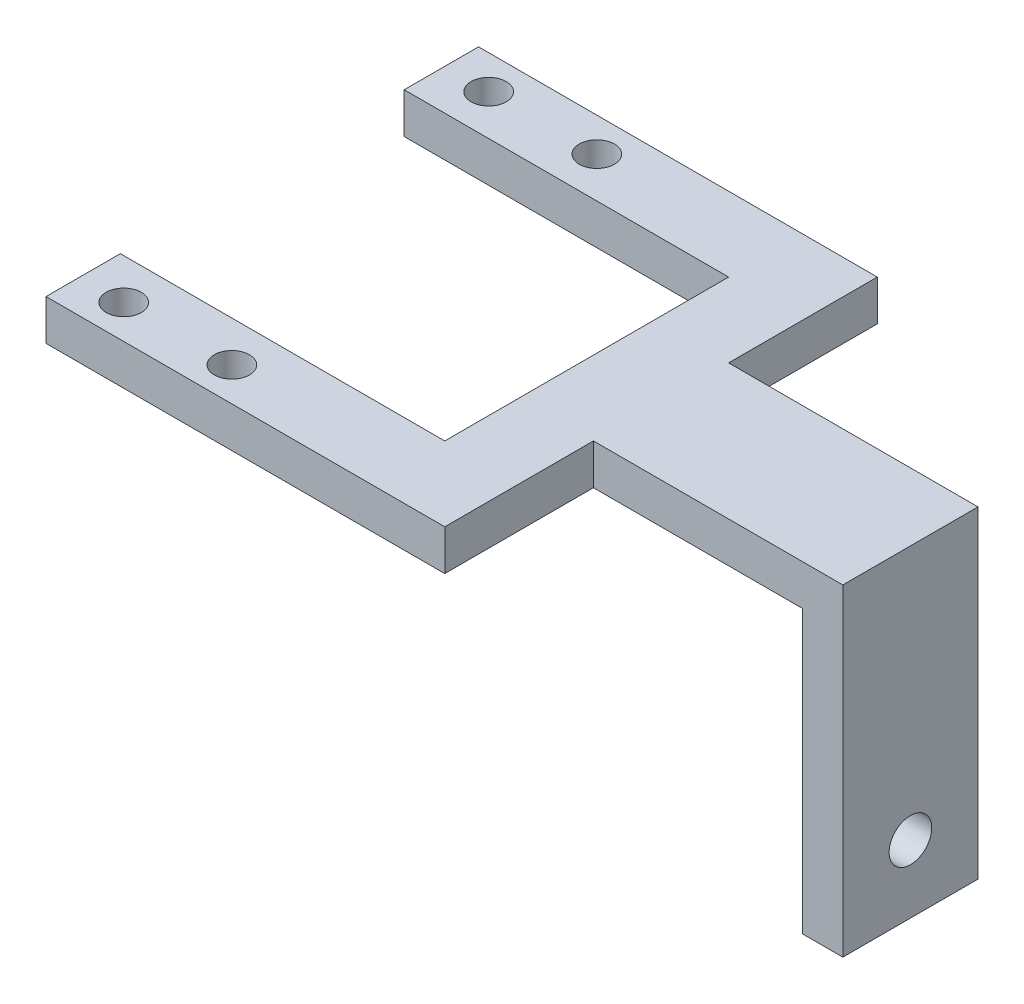
ISO-10303-21;
HEADER;
FILE_DESCRIPTION(('STEP AP214'),'2;1');
FILE_NAME('part.step','',(''),(''),'','','');
FILE_SCHEMA(('AUTOMOTIVE_DESIGN { 1 0 10303 214 1 1 1 1 }'));
ENDSEC;
DATA;
#1=APPLICATION_CONTEXT('core data for automotive mechanical design processes');
#2=APPLICATION_PROTOCOL_DEFINITION('international standard','automotive_design',2000,#1);
#3=PRODUCT_CONTEXT('',#1,'mechanical');
#4=PRODUCT('Part','Part','',(#3));
#5=PRODUCT_RELATED_PRODUCT_CATEGORY('part','',(#4));
#6=PRODUCT_DEFINITION_FORMATION('','',#4);
#7=PRODUCT_DEFINITION_CONTEXT('part definition',#1,'design');
#8=PRODUCT_DEFINITION('design','',#6,#7);
#9=PRODUCT_DEFINITION_SHAPE('','',#8);
#10=(LENGTH_UNIT() NAMED_UNIT(*) SI_UNIT(.MILLI.,.METRE.));
#11=(NAMED_UNIT(*) PLANE_ANGLE_UNIT() SI_UNIT($,.RADIAN.));
#12=(NAMED_UNIT(*) SI_UNIT($,.STERADIAN.) SOLID_ANGLE_UNIT());
#13=UNCERTAINTY_MEASURE_WITH_UNIT(LENGTH_MEASURE(1.E-05),#10,'distance_accuracy_value','');
#14=(GEOMETRIC_REPRESENTATION_CONTEXT(3) GLOBAL_UNCERTAINTY_ASSIGNED_CONTEXT((#13)) GLOBAL_UNIT_ASSIGNED_CONTEXT((#10,
#11,#12)) REPRESENTATION_CONTEXT('',''));
#15=CARTESIAN_POINT('',(0.,0.,0.));
#16=DIRECTION('',(0.,0.,1.));
#17=DIRECTION('',(1.,0.,0.));
#18=AXIS2_PLACEMENT_3D('',#15,#16,#17);
#19=CARTESIAN_POINT('',(0.,-3.,5.));
#20=DIRECTION('',(0.,0.,1.));
#21=DIRECTION('',(1.,0.,0.));
#22=AXIS2_PLACEMENT_3D('',#19,#20,#21);
#23=PLANE('',#22);
#24=DIRECTION('',(1.,0.,0.));
#25=VECTOR('',#24,1.);
#26=CARTESIAN_POINT('',(0.,-3.,5.));
#27=LINE('',#26,#25);
#28=CARTESIAN_POINT('',(14.75,-3.,5.));
#29=VERTEX_POINT('',#28);
#30=CARTESIAN_POINT('',(30.2,-3.,5.));
#31=VERTEX_POINT('',#30);
#32=EDGE_CURVE('E285',#29,#31,#27,.T.);
#33=ORIENTED_EDGE('',*,*,#32,.T.);
#34=DIRECTION('',(0.,1.,0.));
#35=VECTOR('',#34,1.);
#36=CARTESIAN_POINT('',(30.2,-23.85,5.));
#37=LINE('',#36,#35);
#38=CARTESIAN_POINT('',(30.2,-23.85,5.));
#39=VERTEX_POINT('',#38);
#40=EDGE_CURVE('E59',#39,#31,#37,.T.);
#41=ORIENTED_EDGE('',*,*,#40,.F.);
#42=DIRECTION('',(1.,0.,0.));
#43=VECTOR('',#42,1.);
#44=CARTESIAN_POINT('',(0.,-23.85,5.));
#45=LINE('',#44,#43);
#46=CARTESIAN_POINT('',(33.2,-23.85,5.));
#47=VERTEX_POINT('',#46);
#48=EDGE_CURVE('E276',#39,#47,#45,.T.);
#49=ORIENTED_EDGE('',*,*,#48,.T.);
#50=DIRECTION('',(0.,1.,0.));
#51=VECTOR('',#50,1.);
#52=CARTESIAN_POINT('',(33.2,-3.,5.));
#53=LINE('',#52,#51);
#54=CARTESIAN_POINT('',(33.2,0.,5.));
#55=VERTEX_POINT('',#54);
#56=EDGE_CURVE('E45',#47,#55,#53,.T.);
#57=ORIENTED_EDGE('',*,*,#56,.T.);
#58=DIRECTION('',(1.,0.,0.));
#59=VECTOR('',#58,1.);
#60=CARTESIAN_POINT('',(0.,0.,5.));
#61=LINE('',#60,#59);
#62=CARTESIAN_POINT('',(14.75,0.,5.));
#63=VERTEX_POINT('',#62);
#64=EDGE_CURVE('E196',#63,#55,#61,.T.);
#65=ORIENTED_EDGE('',*,*,#64,.F.);
#66=DIRECTION('',(0.,1.,0.));
#67=VECTOR('',#66,1.);
#68=CARTESIAN_POINT('',(14.75,-3.,5.));
#69=LINE('',#68,#67);
#70=EDGE_CURVE('E11',#29,#63,#69,.T.);
#71=ORIENTED_EDGE('',*,*,#70,.F.);
#72=EDGE_LOOP('',(#33,#41,#49,#57,#65,#71));
#73=FACE_BOUND('',#72,.T.);
#74=ADVANCED_FACE('F41',(#73),#23,.T.);
#75=CARTESIAN_POINT('',(14.75,-3.,0.));
#76=DIRECTION('',(-1.,0.,0.));
#77=DIRECTION('',(0.,0.,1.));
#78=AXIS2_PLACEMENT_3D('',#75,#76,#77);
#79=PLANE('',#78);
#80=DIRECTION('',(0.,0.,1.));
#81=VECTOR('',#80,1.);
#82=CARTESIAN_POINT('',(14.75,0.,0.));
#83=LINE('',#82,#81);
#84=CARTESIAN_POINT('',(14.75,0.,16.));
#85=VERTEX_POINT('',#84);
#86=EDGE_CURVE('E235',#63,#85,#83,.T.);
#87=ORIENTED_EDGE('',*,*,#86,.T.);
#88=DIRECTION('',(0.,1.,0.));
#89=VECTOR('',#88,1.);
#90=CARTESIAN_POINT('',(14.75,-3.,16.));
#91=LINE('',#90,#89);
#92=CARTESIAN_POINT('',(14.75,-3.,16.));
#93=VERTEX_POINT('',#92);
#94=EDGE_CURVE('E51',#93,#85,#91,.T.);
#95=ORIENTED_EDGE('',*,*,#94,.F.);
#96=DIRECTION('',(0.,0.,1.));
#97=VECTOR('',#96,1.);
#98=CARTESIAN_POINT('',(14.75,-3.,0.));
#99=LINE('',#98,#97);
#100=EDGE_CURVE('E152',#29,#93,#99,.T.);
#101=ORIENTED_EDGE('',*,*,#100,.F.);
#102=ORIENTED_EDGE('',*,*,#70,.T.);
#103=EDGE_LOOP('',(#87,#95,#101,#102));
#104=FACE_BOUND('',#103,.T.);
#105=ADVANCED_FACE('F284',(#104),#79,.F.);
#106=CARTESIAN_POINT('',(0.,-3.,16.));
#107=DIRECTION('',(0.,0.,-1.));
#108=DIRECTION('',(-1.,0.,0.));
#109=AXIS2_PLACEMENT_3D('',#106,#107,#108);
#110=PLANE('',#109);
#111=DIRECTION('',(-1.,0.,0.));
#112=VECTOR('',#111,1.);
#113=CARTESIAN_POINT('',(0.,0.,16.));
#114=LINE('',#113,#112);
#115=CARTESIAN_POINT('',(-14.75,0.,16.));
#116=VERTEX_POINT('',#115);
#117=EDGE_CURVE('E161',#85,#116,#114,.T.);
#118=ORIENTED_EDGE('',*,*,#117,.T.);
#119=DIRECTION('',(0.,1.,0.));
#120=VECTOR('',#119,1.);
#121=CARTESIAN_POINT('',(-14.75,-3.,16.));
#122=LINE('',#121,#120);
#123=CARTESIAN_POINT('',(-14.75,-3.,16.));
#124=VERTEX_POINT('',#123);
#125=EDGE_CURVE('E159',#124,#116,#122,.T.);
#126=ORIENTED_EDGE('',*,*,#125,.F.);
#127=DIRECTION('',(-1.,0.,0.));
#128=VECTOR('',#127,1.);
#129=CARTESIAN_POINT('',(0.,-3.,16.));
#130=LINE('',#129,#128);
#131=EDGE_CURVE('E143',#93,#124,#130,.T.);
#132=ORIENTED_EDGE('',*,*,#131,.F.);
#133=ORIENTED_EDGE('',*,*,#94,.T.);
#134=EDGE_LOOP('',(#118,#126,#132,#133));
#135=FACE_BOUND('',#134,.T.);
#136=ADVANCED_FACE('F160',(#135),#110,.F.);
#137=CARTESIAN_POINT('',(-14.75,-3.,0.));
#138=DIRECTION('',(-1.,0.,0.));
#139=DIRECTION('',(0.,0.,1.));
#140=AXIS2_PLACEMENT_3D('',#137,#138,#139);
#141=PLANE('',#140);
#142=DIRECTION('',(0.,0.,1.));
#143=VECTOR('',#142,1.);
#144=CARTESIAN_POINT('',(-14.75,0.,0.));
#145=LINE('',#144,#143);
#146=CARTESIAN_POINT('',(-14.75,0.,10.5));
#147=VERTEX_POINT('',#146);
#148=EDGE_CURVE('E230',#147,#116,#145,.T.);
#149=ORIENTED_EDGE('',*,*,#148,.F.);
#150=DIRECTION('',(0.,1.,0.));
#151=VECTOR('',#150,1.);
#152=CARTESIAN_POINT('',(-14.75,-3.,10.5));
#153=LINE('',#152,#151);
#154=CARTESIAN_POINT('',(-14.75,-3.,10.5));
#155=VERTEX_POINT('',#154);
#156=EDGE_CURVE('E166',#155,#147,#153,.T.);
#157=ORIENTED_EDGE('',*,*,#156,.F.);
#158=DIRECTION('',(0.,0.,1.));
#159=VECTOR('',#158,1.);
#160=CARTESIAN_POINT('',(-14.75,-3.,0.));
#161=LINE('',#160,#159);
#162=EDGE_CURVE('E149',#155,#124,#161,.T.);
#163=ORIENTED_EDGE('',*,*,#162,.T.);
#164=ORIENTED_EDGE('',*,*,#125,.T.);
#165=EDGE_LOOP('',(#149,#157,#163,#164));
#166=FACE_BOUND('',#165,.T.);
#167=ADVANCED_FACE('F168',(#166),#141,.T.);
#168=CARTESIAN_POINT('',(0.,-3.,10.5));
#169=DIRECTION('',(0.,0.,-1.));
#170=DIRECTION('',(-1.,0.,0.));
#171=AXIS2_PLACEMENT_3D('',#168,#169,#170);
#172=PLANE('',#171);
#173=DIRECTION('',(-1.,0.,0.));
#174=VECTOR('',#173,1.);
#175=CARTESIAN_POINT('',(0.,0.,10.5));
#176=LINE('',#175,#174);
#177=CARTESIAN_POINT('',(9.25000000000001,0.,10.5));
#178=VERTEX_POINT('',#177);
#179=EDGE_CURVE('E226',#178,#147,#176,.T.);
#180=ORIENTED_EDGE('',*,*,#179,.F.);
#181=DIRECTION('',(0.,1.,0.));
#182=VECTOR('',#181,1.);
#183=CARTESIAN_POINT('',(9.25000000000001,-3.,10.5));
#184=LINE('',#183,#182);
#185=CARTESIAN_POINT('',(9.25000000000001,-3.,10.5));
#186=VERTEX_POINT('',#185);
#187=EDGE_CURVE('E247',#186,#178,#184,.T.);
#188=ORIENTED_EDGE('',*,*,#187,.F.);
#189=DIRECTION('',(-1.,0.,0.));
#190=VECTOR('',#189,1.);
#191=CARTESIAN_POINT('',(0.,-3.,10.5));
#192=LINE('',#191,#190);
#193=EDGE_CURVE('E170',#186,#155,#192,.T.);
#194=ORIENTED_EDGE('',*,*,#193,.T.);
#195=ORIENTED_EDGE('',*,*,#156,.T.);
#196=EDGE_LOOP('',(#180,#188,#194,#195));
#197=FACE_BOUND('',#196,.T.);
#198=ADVANCED_FACE('F528',(#197),#172,.T.);
#199=CARTESIAN_POINT('',(9.25000000000001,-3.,0.));
#200=DIRECTION('',(-1.,0.,0.));
#201=DIRECTION('',(0.,0.,1.));
#202=AXIS2_PLACEMENT_3D('',#199,#200,#201);
#203=PLANE('',#202);
#204=DIRECTION('',(0.,0.,1.));
#205=VECTOR('',#204,1.);
#206=CARTESIAN_POINT('',(9.25000000000001,0.,0.));
#207=LINE('',#206,#205);
#208=CARTESIAN_POINT('',(9.25,0.,-10.5));
#209=VERTEX_POINT('',#208);
#210=EDGE_CURVE('E222',#209,#178,#207,.T.);
#211=ORIENTED_EDGE('',*,*,#210,.F.);
#212=DIRECTION('',(0.,1.,0.));
#213=VECTOR('',#212,1.);
#214=CARTESIAN_POINT('',(9.25,-3.,-10.5));
#215=LINE('',#214,#213);
#216=CARTESIAN_POINT('',(9.25,-3.,-10.5));
#217=VERTEX_POINT('',#216);
#218=EDGE_CURVE('E250',#217,#209,#215,.T.);
#219=ORIENTED_EDGE('',*,*,#218,.F.);
#220=DIRECTION('',(0.,0.,1.));
#221=VECTOR('',#220,1.);
#222=CARTESIAN_POINT('',(9.25000000000001,-3.,0.));
#223=LINE('',#222,#221);
#224=EDGE_CURVE('E173',#217,#186,#223,.T.);
#225=ORIENTED_EDGE('',*,*,#224,.T.);
#226=ORIENTED_EDGE('',*,*,#187,.T.);
#227=EDGE_LOOP('',(#211,#219,#225,#226));
#228=FACE_BOUND('',#227,.T.);
#229=ADVANCED_FACE('F316',(#228),#203,.T.);
#230=CARTESIAN_POINT('',(0.,-3.,-10.5));
#231=DIRECTION('',(0.,0.,1.));
#232=DIRECTION('',(1.,0.,0.));
#233=AXIS2_PLACEMENT_3D('',#230,#231,#232);
#234=PLANE('',#233);
#235=DIRECTION('',(1.,0.,0.));
#236=VECTOR('',#235,1.);
#237=CARTESIAN_POINT('',(0.,0.,-10.5));
#238=LINE('',#237,#236);
#239=CARTESIAN_POINT('',(-14.75,0.,-10.5));
#240=VERTEX_POINT('',#239);
#241=EDGE_CURVE('E218',#240,#209,#238,.T.);
#242=ORIENTED_EDGE('',*,*,#241,.F.);
#243=DIRECTION('',(0.,1.,0.));
#244=VECTOR('',#243,1.);
#245=CARTESIAN_POINT('',(-14.75,-3.,-10.5));
#246=LINE('',#245,#244);
#247=CARTESIAN_POINT('',(-14.75,-3.,-10.5));
#248=VERTEX_POINT('',#247);
#249=EDGE_CURVE('E253',#248,#240,#246,.T.);
#250=ORIENTED_EDGE('',*,*,#249,.F.);
#251=DIRECTION('',(1.,0.,0.));
#252=VECTOR('',#251,1.);
#253=CARTESIAN_POINT('',(0.,-3.,-10.5));
#254=LINE('',#253,#252);
#255=EDGE_CURVE('E308',#248,#217,#254,.T.);
#256=ORIENTED_EDGE('',*,*,#255,.T.);
#257=ORIENTED_EDGE('',*,*,#218,.T.);
#258=EDGE_LOOP('',(#242,#250,#256,#257));
#259=FACE_BOUND('',#258,.T.);
#260=ADVANCED_FACE('F322',(#259),#234,.T.);
#261=CARTESIAN_POINT('',(-14.75,-3.,0.));
#262=DIRECTION('',(-1.,0.,0.));
#263=DIRECTION('',(0.,0.,1.));
#264=AXIS2_PLACEMENT_3D('',#261,#262,#263);
#265=PLANE('',#264);
#266=DIRECTION('',(0.,0.,1.));
#267=VECTOR('',#266,1.);
#268=CARTESIAN_POINT('',(-14.75,0.,0.));
#269=LINE('',#268,#267);
#270=CARTESIAN_POINT('',(-14.75,0.,-16.));
#271=VERTEX_POINT('',#270);
#272=EDGE_CURVE('E214',#271,#240,#269,.T.);
#273=ORIENTED_EDGE('',*,*,#272,.F.);
#274=DIRECTION('',(0.,1.,0.));
#275=VECTOR('',#274,1.);
#276=CARTESIAN_POINT('',(-14.75,-3.,-16.));
#277=LINE('',#276,#275);
#278=CARTESIAN_POINT('',(-14.75,-3.,-16.));
#279=VERTEX_POINT('',#278);
#280=EDGE_CURVE('E256',#279,#271,#277,.T.);
#281=ORIENTED_EDGE('',*,*,#280,.F.);
#282=DIRECTION('',(0.,0.,1.));
#283=VECTOR('',#282,1.);
#284=CARTESIAN_POINT('',(-14.75,-3.,0.));
#285=LINE('',#284,#283);
#286=EDGE_CURVE('E304',#279,#248,#285,.T.);
#287=ORIENTED_EDGE('',*,*,#286,.T.);
#288=ORIENTED_EDGE('',*,*,#249,.T.);
#289=EDGE_LOOP('',(#273,#281,#287,#288));
#290=FACE_BOUND('',#289,.T.);
#291=ADVANCED_FACE('F325',(#290),#265,.T.);
#292=CARTESIAN_POINT('',(0.,-3.,-16.));
#293=DIRECTION('',(0.,0.,-1.));
#294=DIRECTION('',(-1.,0.,0.));
#295=AXIS2_PLACEMENT_3D('',#292,#293,#294);
#296=PLANE('',#295);
#297=DIRECTION('',(-1.,0.,0.));
#298=VECTOR('',#297,1.);
#299=CARTESIAN_POINT('',(0.,0.,-16.));
#300=LINE('',#299,#298);
#301=CARTESIAN_POINT('',(14.75,0.,-16.));
#302=VERTEX_POINT('',#301);
#303=EDGE_CURVE('E210',#302,#271,#300,.T.);
#304=ORIENTED_EDGE('',*,*,#303,.F.);
#305=DIRECTION('',(0.,1.,0.));
#306=VECTOR('',#305,1.);
#307=CARTESIAN_POINT('',(14.75,-3.,-16.));
#308=LINE('',#307,#306);
#309=CARTESIAN_POINT('',(14.75,-3.,-16.));
#310=VERTEX_POINT('',#309);
#311=EDGE_CURVE('E259',#310,#302,#308,.T.);
#312=ORIENTED_EDGE('',*,*,#311,.F.);
#313=DIRECTION('',(-1.,0.,0.));
#314=VECTOR('',#313,1.);
#315=CARTESIAN_POINT('',(0.,-3.,-16.));
#316=LINE('',#315,#314);
#317=EDGE_CURVE('E300',#310,#279,#316,.T.);
#318=ORIENTED_EDGE('',*,*,#317,.T.);
#319=ORIENTED_EDGE('',*,*,#280,.T.);
#320=EDGE_LOOP('',(#304,#312,#318,#319));
#321=FACE_BOUND('',#320,.T.);
#322=ADVANCED_FACE('F329',(#321),#296,.T.);
#323=CARTESIAN_POINT('',(14.75,-3.,0.));
#324=DIRECTION('',(-1.,0.,0.));
#325=DIRECTION('',(0.,0.,1.));
#326=AXIS2_PLACEMENT_3D('',#323,#324,#325);
#327=PLANE('',#326);
#328=DIRECTION('',(0.,0.,1.));
#329=VECTOR('',#328,1.);
#330=CARTESIAN_POINT('',(14.75,0.,0.));
#331=LINE('',#330,#329);
#332=CARTESIAN_POINT('',(14.75,0.,-5.));
#333=VERTEX_POINT('',#332);
#334=EDGE_CURVE('E206',#302,#333,#331,.T.);
#335=ORIENTED_EDGE('',*,*,#334,.T.);
#336=DIRECTION('',(0.,1.,0.));
#337=VECTOR('',#336,1.);
#338=CARTESIAN_POINT('',(14.75,-3.,-5.));
#339=LINE('',#338,#337);
#340=CARTESIAN_POINT('',(14.75,-3.,-5.));
#341=VERTEX_POINT('',#340);
#342=EDGE_CURVE('E262',#341,#333,#339,.T.);
#343=ORIENTED_EDGE('',*,*,#342,.F.);
#344=DIRECTION('',(0.,0.,1.));
#345=VECTOR('',#344,1.);
#346=CARTESIAN_POINT('',(14.75,-3.,0.));
#347=LINE('',#346,#345);
#348=EDGE_CURVE('E291',#310,#341,#347,.T.);
#349=ORIENTED_EDGE('',*,*,#348,.F.);
#350=ORIENTED_EDGE('',*,*,#311,.T.);
#351=EDGE_LOOP('',(#335,#343,#349,#350));
#352=FACE_BOUND('',#351,.T.);
#353=ADVANCED_FACE('F333',(#352),#327,.F.);
#354=CARTESIAN_POINT('',(0.,-3.,-5.));
#355=DIRECTION('',(0.,0.,1.));
#356=DIRECTION('',(1.,0.,0.));
#357=AXIS2_PLACEMENT_3D('',#354,#355,#356);
#358=PLANE('',#357);
#359=DIRECTION('',(1.,0.,0.));
#360=VECTOR('',#359,1.);
#361=CARTESIAN_POINT('',(0.,0.,-5.));
#362=LINE('',#361,#360);
#363=CARTESIAN_POINT('',(33.2,0.,-5.));
#364=VERTEX_POINT('',#363);
#365=EDGE_CURVE('E203',#333,#364,#362,.T.);
#366=ORIENTED_EDGE('',*,*,#365,.T.);
#367=DIRECTION('',(0.,1.,0.));
#368=VECTOR('',#367,1.);
#369=CARTESIAN_POINT('',(33.2,-3.,-5.));
#370=LINE('',#369,#368);
#371=CARTESIAN_POINT('',(33.2,-23.85,-5.));
#372=VERTEX_POINT('',#371);
#373=EDGE_CURVE('E264',#372,#364,#370,.T.);
#374=ORIENTED_EDGE('',*,*,#373,.F.);
#375=DIRECTION('',(1.,0.,0.));
#376=VECTOR('',#375,1.);
#377=CARTESIAN_POINT('',(0.,-23.85,-5.));
#378=LINE('',#377,#376);
#379=CARTESIAN_POINT('',(30.2,-23.85,-5.));
#380=VERTEX_POINT('',#379);
#381=EDGE_CURVE('E350',#380,#372,#378,.T.);
#382=ORIENTED_EDGE('',*,*,#381,.F.);
#383=DIRECTION('',(0.,1.,0.));
#384=VECTOR('',#383,1.);
#385=CARTESIAN_POINT('',(30.2,-23.85,-5.));
#386=LINE('',#385,#384);
#387=CARTESIAN_POINT('',(30.2,-3.,-5.));
#388=VERTEX_POINT('',#387);
#389=EDGE_CURVE('E342',#380,#388,#386,.T.);
#390=ORIENTED_EDGE('',*,*,#389,.T.);
#391=DIRECTION('',(1.,0.,0.));
#392=VECTOR('',#391,1.);
#393=CARTESIAN_POINT('',(0.,-3.,-5.));
#394=LINE('',#393,#392);
#395=EDGE_CURVE('E118',#341,#388,#394,.T.);
#396=ORIENTED_EDGE('',*,*,#395,.F.);
#397=ORIENTED_EDGE('',*,*,#342,.T.);
#398=EDGE_LOOP('',(#366,#374,#382,#390,#396,#397));
#399=FACE_BOUND('',#398,.T.);
#400=ADVANCED_FACE('F351',(#399),#358,.F.);
#401=CARTESIAN_POINT('',(33.2,-3.,0.));
#402=DIRECTION('',(-1.,0.,0.));
#403=DIRECTION('',(0.,0.,1.));
#404=AXIS2_PLACEMENT_3D('',#401,#402,#403);
#405=PLANE('',#404);
#406=CARTESIAN_POINT('',(33.2,-18.85,0.));
#407=DIRECTION('',(-1.,0.,0.));
#408=DIRECTION('',(0.,0.,1.));
#409=AXIS2_PLACEMENT_3D('',#406,#407,#408);
#410=CIRCLE('',#409,1.57541108701888);
#411=CARTESIAN_POINT('',(33.2,-18.85,1.57541108701888));
#412=VERTEX_POINT('',#411);
#413=EDGE_CURVE('E354',#412,#412,#410,.F.);
#414=ORIENTED_EDGE('',*,*,#413,.F.);
#415=EDGE_LOOP('',(#414));
#416=FACE_BOUND('',#415,.T.);
#417=DIRECTION('',(0.,0.,1.));
#418=VECTOR('',#417,1.);
#419=CARTESIAN_POINT('',(33.2,0.,0.));
#420=LINE('',#419,#418);
#421=EDGE_CURVE('E199',#364,#55,#420,.T.);
#422=ORIENTED_EDGE('',*,*,#421,.T.);
#423=ORIENTED_EDGE('',*,*,#56,.F.);
#424=DIRECTION('',(0.,0.,1.));
#425=VECTOR('',#424,1.);
#426=CARTESIAN_POINT('',(33.2,-23.85,0.));
#427=LINE('',#426,#425);
#428=EDGE_CURVE('E347',#372,#47,#427,.T.);
#429=ORIENTED_EDGE('',*,*,#428,.F.);
#430=ORIENTED_EDGE('',*,*,#373,.T.);
#431=EDGE_LOOP('',(#422,#423,#429,#430));
#432=FACE_BOUND('',#431,.T.);
#433=ADVANCED_FACE('F279',(#416,#432),#405,.F.);
#434=CARTESIAN_POINT('',(-11.5,-3.,13.5));
#435=DIRECTION('',(0.,1.,0.));
#436=DIRECTION('',(0.,0.,1.));
#437=AXIS2_PLACEMENT_3D('',#434,#435,#436);
#438=CYLINDRICAL_SURFACE('',#437,1.3);
#439=CARTESIAN_POINT('',(-11.5,-3.,13.5));
#440=DIRECTION('',(0.,1.,0.));
#441=DIRECTION('',(0.,0.,1.));
#442=AXIS2_PLACEMENT_3D('',#439,#440,#441);
#443=CIRCLE('',#442,1.3);
#444=CARTESIAN_POINT('',(-11.5,-3.,14.8));
#445=VERTEX_POINT('',#444);
#446=EDGE_CURVE('E287',#445,#445,#443,.T.);
#447=ORIENTED_EDGE('',*,*,#446,.F.);
#448=EDGE_LOOP('',(#447));
#449=FACE_BOUND('',#448,.T.);
#450=CARTESIAN_POINT('',(-11.5,0.,13.5));
#451=DIRECTION('',(0.,1.,0.));
#452=DIRECTION('',(0.,0.,1.));
#453=AXIS2_PLACEMENT_3D('',#450,#451,#452);
#454=CIRCLE('',#453,1.3);
#455=CARTESIAN_POINT('',(-11.5,0.,14.8));
#456=VERTEX_POINT('',#455);
#457=EDGE_CURVE('E192',#456,#456,#454,.T.);
#458=ORIENTED_EDGE('',*,*,#457,.T.);
#459=EDGE_LOOP('',(#458));
#460=FACE_BOUND('',#459,.T.);
#461=ADVANCED_FACE('F380',(#449,#460),#438,.F.);
#462=CARTESIAN_POINT('',(-3.49999999999999,-3.,13.5));
#463=DIRECTION('',(0.,1.,0.));
#464=DIRECTION('',(0.,0.,1.));
#465=AXIS2_PLACEMENT_3D('',#462,#463,#464);
#466=CYLINDRICAL_SURFACE('',#465,1.3);
#467=CARTESIAN_POINT('',(-3.49999999999999,-3.,13.5));
#468=DIRECTION('',(0.,1.,0.));
#469=DIRECTION('',(0.,0.,1.));
#470=AXIS2_PLACEMENT_3D('',#467,#468,#469);
#471=CIRCLE('',#470,1.3);
#472=CARTESIAN_POINT('',(-3.49999999999999,-3.,14.8));
#473=VERTEX_POINT('',#472);
#474=EDGE_CURVE('E294',#473,#473,#471,.T.);
#475=ORIENTED_EDGE('',*,*,#474,.F.);
#476=EDGE_LOOP('',(#475));
#477=FACE_BOUND('',#476,.T.);
#478=CARTESIAN_POINT('',(-3.49999999999999,0.,13.5));
#479=DIRECTION('',(0.,1.,0.));
#480=DIRECTION('',(0.,0.,1.));
#481=AXIS2_PLACEMENT_3D('',#478,#479,#480);
#482=CIRCLE('',#481,1.3);
#483=CARTESIAN_POINT('',(-3.49999999999999,0.,14.8));
#484=VERTEX_POINT('',#483);
#485=EDGE_CURVE('E187',#484,#484,#482,.T.);
#486=ORIENTED_EDGE('',*,*,#485,.T.);
#487=EDGE_LOOP('',(#486));
#488=FACE_BOUND('',#487,.T.);
#489=ADVANCED_FACE('F377',(#477,#488),#466,.F.);
#490=CARTESIAN_POINT('',(-3.49999999999999,-3.,-13.5));
#491=DIRECTION('',(0.,1.,0.));
#492=DIRECTION('',(0.,0.,1.));
#493=AXIS2_PLACEMENT_3D('',#490,#491,#492);
#494=CYLINDRICAL_SURFACE('',#493,1.3);
#495=CARTESIAN_POINT('',(-3.49999999999999,-3.,-13.5));
#496=DIRECTION('',(0.,1.,0.));
#497=DIRECTION('',(0.,0.,1.));
#498=AXIS2_PLACEMENT_3D('',#495,#496,#497);
#499=CIRCLE('',#498,1.3);
#500=CARTESIAN_POINT('',(-3.49999999999999,-3.,-12.2));
#501=VERTEX_POINT('',#500);
#502=EDGE_CURVE('E241',#501,#501,#499,.F.);
#503=ORIENTED_EDGE('',*,*,#502,.T.);
#504=EDGE_LOOP('',(#503));
#505=FACE_BOUND('',#504,.T.);
#506=CARTESIAN_POINT('',(-3.49999999999999,0.,-13.5));
#507=DIRECTION('',(0.,1.,0.));
#508=DIRECTION('',(0.,0.,1.));
#509=AXIS2_PLACEMENT_3D('',#506,#507,#508);
#510=CIRCLE('',#509,1.3);
#511=CARTESIAN_POINT('',(-3.49999999999999,0.,-12.2));
#512=VERTEX_POINT('',#511);
#513=EDGE_CURVE('E183',#512,#512,#510,.F.);
#514=ORIENTED_EDGE('',*,*,#513,.F.);
#515=EDGE_LOOP('',(#514));
#516=FACE_BOUND('',#515,.T.);
#517=ADVANCED_FACE('F43',(#505,#516),#494,.F.);
#518=CARTESIAN_POINT('',(-11.5,-3.,-13.5));
#519=DIRECTION('',(0.,1.,0.));
#520=DIRECTION('',(0.,0.,1.));
#521=AXIS2_PLACEMENT_3D('',#518,#519,#520);
#522=CYLINDRICAL_SURFACE('',#521,1.3);
#523=CARTESIAN_POINT('',(-11.5,-3.,-13.5));
#524=DIRECTION('',(0.,1.,0.));
#525=DIRECTION('',(0.,0.,1.));
#526=AXIS2_PLACEMENT_3D('',#523,#524,#525);
#527=CIRCLE('',#526,1.3);
#528=CARTESIAN_POINT('',(-11.5,-3.,-12.2));
#529=VERTEX_POINT('',#528);
#530=EDGE_CURVE('E179',#529,#529,#527,.F.);
#531=ORIENTED_EDGE('',*,*,#530,.T.);
#532=EDGE_LOOP('',(#531));
#533=FACE_BOUND('',#532,.T.);
#534=CARTESIAN_POINT('',(-11.5,0.,-13.5));
#535=DIRECTION('',(0.,1.,0.));
#536=DIRECTION('',(0.,0.,1.));
#537=AXIS2_PLACEMENT_3D('',#534,#535,#536);
#538=CIRCLE('',#537,1.3);
#539=CARTESIAN_POINT('',(-11.5,0.,-12.2));
#540=VERTEX_POINT('',#539);
#541=EDGE_CURVE('E238',#540,#540,#538,.F.);
#542=ORIENTED_EDGE('',*,*,#541,.F.);
#543=EDGE_LOOP('',(#542));
#544=FACE_BOUND('',#543,.T.);
#545=ADVANCED_FACE('F390',(#533,#544),#522,.F.);
#546=CARTESIAN_POINT('',(0.,-3.,0.));
#547=DIRECTION('',(0.,1.,0.));
#548=DIRECTION('',(0.,0.,1.));
#549=AXIS2_PLACEMENT_3D('',#546,#547,#548);
#550=PLANE('',#549);
#551=ORIENTED_EDGE('',*,*,#502,.F.);
#552=EDGE_LOOP('',(#551));
#553=FACE_BOUND('',#552,.T.);
#554=ORIENTED_EDGE('',*,*,#474,.T.);
#555=EDGE_LOOP('',(#554));
#556=FACE_BOUND('',#555,.T.);
#557=ORIENTED_EDGE('',*,*,#446,.T.);
#558=EDGE_LOOP('',(#557));
#559=FACE_BOUND('',#558,.T.);
#560=ORIENTED_EDGE('',*,*,#395,.T.);
#561=DIRECTION('',(0.,0.,1.));
#562=VECTOR('',#561,1.);
#563=CARTESIAN_POINT('',(30.2,-3.,0.));
#564=LINE('',#563,#562);
#565=EDGE_CURVE('E188',#388,#31,#564,.T.);
#566=ORIENTED_EDGE('',*,*,#565,.T.);
#567=ORIENTED_EDGE('',*,*,#32,.F.);
#568=ORIENTED_EDGE('',*,*,#100,.T.);
#569=ORIENTED_EDGE('',*,*,#131,.T.);
#570=ORIENTED_EDGE('',*,*,#162,.F.);
#571=ORIENTED_EDGE('',*,*,#193,.F.);
#572=ORIENTED_EDGE('',*,*,#224,.F.);
#573=ORIENTED_EDGE('',*,*,#255,.F.);
#574=ORIENTED_EDGE('',*,*,#286,.F.);
#575=ORIENTED_EDGE('',*,*,#317,.F.);
#576=ORIENTED_EDGE('',*,*,#348,.T.);
#577=EDGE_LOOP('',(#560,#566,#567,#568,#569,#570,#571,#572,#573,#574,#575,#576));
#578=FACE_BOUND('',#577,.T.);
#579=ORIENTED_EDGE('',*,*,#530,.F.);
#580=EDGE_LOOP('',(#579));
#581=FACE_BOUND('',#580,.T.);
#582=ADVANCED_FACE('F145',(#553,#556,#559,#578,#581),#550,.F.);
#583=CARTESIAN_POINT('',(0.,0.,0.));
#584=DIRECTION('',(0.,1.,0.));
#585=DIRECTION('',(0.,0.,1.));
#586=AXIS2_PLACEMENT_3D('',#583,#584,#585);
#587=PLANE('',#586);
#588=ORIENTED_EDGE('',*,*,#64,.T.);
#589=ORIENTED_EDGE('',*,*,#421,.F.);
#590=ORIENTED_EDGE('',*,*,#365,.F.);
#591=ORIENTED_EDGE('',*,*,#334,.F.);
#592=ORIENTED_EDGE('',*,*,#303,.T.);
#593=ORIENTED_EDGE('',*,*,#272,.T.);
#594=ORIENTED_EDGE('',*,*,#241,.T.);
#595=ORIENTED_EDGE('',*,*,#210,.T.);
#596=ORIENTED_EDGE('',*,*,#179,.T.);
#597=ORIENTED_EDGE('',*,*,#148,.T.);
#598=ORIENTED_EDGE('',*,*,#117,.F.);
#599=ORIENTED_EDGE('',*,*,#86,.F.);
#600=EDGE_LOOP('',(#588,#589,#590,#591,#592,#593,#594,#595,#596,#597,#598,#599));
#601=FACE_BOUND('',#600,.T.);
#602=ORIENTED_EDGE('',*,*,#513,.T.);
#603=EDGE_LOOP('',(#602));
#604=FACE_BOUND('',#603,.T.);
#605=ORIENTED_EDGE('',*,*,#485,.F.);
#606=EDGE_LOOP('',(#605));
#607=FACE_BOUND('',#606,.T.);
#608=ORIENTED_EDGE('',*,*,#457,.F.);
#609=EDGE_LOOP('',(#608));
#610=FACE_BOUND('',#609,.T.);
#611=ORIENTED_EDGE('',*,*,#541,.T.);
#612=EDGE_LOOP('',(#611));
#613=FACE_BOUND('',#612,.T.);
#614=ADVANCED_FACE('F281',(#601,#604,#607,#610,#613),#587,.T.);
#615=CARTESIAN_POINT('',(30.2,-23.85,0.));
#616=DIRECTION('',(-1.,0.,0.));
#617=DIRECTION('',(0.,0.,1.));
#618=AXIS2_PLACEMENT_3D('',#615,#616,#617);
#619=PLANE('',#618);
#620=CARTESIAN_POINT('',(30.2,-18.85,0.));
#621=DIRECTION('',(-1.,0.,0.));
#622=DIRECTION('',(0.,0.,1.));
#623=AXIS2_PLACEMENT_3D('',#620,#621,#622);
#624=CIRCLE('',#623,1.57541108701888);
#625=CARTESIAN_POINT('',(30.2,-18.85,1.57541108701888));
#626=VERTEX_POINT('',#625);
#627=EDGE_CURVE('E425',#626,#626,#624,.T.);
#628=ORIENTED_EDGE('',*,*,#627,.F.);
#629=EDGE_LOOP('',(#628));
#630=FACE_BOUND('',#629,.T.);
#631=ORIENTED_EDGE('',*,*,#565,.F.);
#632=ORIENTED_EDGE('',*,*,#389,.F.);
#633=DIRECTION('',(0.,0.,1.));
#634=VECTOR('',#633,1.);
#635=CARTESIAN_POINT('',(30.2,-23.85,0.));
#636=LINE('',#635,#634);
#637=EDGE_CURVE('E345',#380,#39,#636,.T.);
#638=ORIENTED_EDGE('',*,*,#637,.T.);
#639=ORIENTED_EDGE('',*,*,#40,.T.);
#640=EDGE_LOOP('',(#631,#632,#638,#639));
#641=FACE_BOUND('',#640,.T.);
#642=ADVANCED_FACE('F343',(#630,#641),#619,.T.);
#643=CARTESIAN_POINT('',(0.,-23.85,0.));
#644=DIRECTION('',(0.,1.,0.));
#645=DIRECTION('',(0.,0.,1.));
#646=AXIS2_PLACEMENT_3D('',#643,#644,#645);
#647=PLANE('',#646);
#648=ORIENTED_EDGE('',*,*,#381,.T.);
#649=ORIENTED_EDGE('',*,*,#428,.T.);
#650=ORIENTED_EDGE('',*,*,#48,.F.);
#651=ORIENTED_EDGE('',*,*,#637,.F.);
#652=EDGE_LOOP('',(#648,#649,#650,#651));
#653=FACE_BOUND('',#652,.T.);
#654=ADVANCED_FACE('F356',(#653),#647,.F.);
#655=CARTESIAN_POINT('',(37.6559354511501,-18.85,0.));
#656=DIRECTION('',(-1.,0.,0.));
#657=DIRECTION('',(0.,0.,1.));
#658=AXIS2_PLACEMENT_3D('',#655,#656,#657);
#659=CYLINDRICAL_SURFACE('',#658,1.57541108701888);
#660=ORIENTED_EDGE('',*,*,#413,.T.);
#661=EDGE_LOOP('',(#660));
#662=FACE_BOUND('',#661,.T.);
#663=ORIENTED_EDGE('',*,*,#627,.T.);
#664=EDGE_LOOP('',(#663));
#665=FACE_BOUND('',#664,.T.);
#666=ADVANCED_FACE('F431',(#662,#665),#659,.F.);
#667=CLOSED_SHELL('',(#74,#105,#136,#167,#198,#229,#260,#291,#322,#353,#400,#433,#461,#489,#517,
#545,#582,#614,#642,#654,#666));
#668=MANIFOLD_SOLID_BREP('B2',#667);
#669=ADVANCED_BREP_SHAPE_REPRESENTATION('',(#18,#668),#14);
#670=SHAPE_DEFINITION_REPRESENTATION(#9,#669);
ENDSEC;
END-ISO-10303-21;
